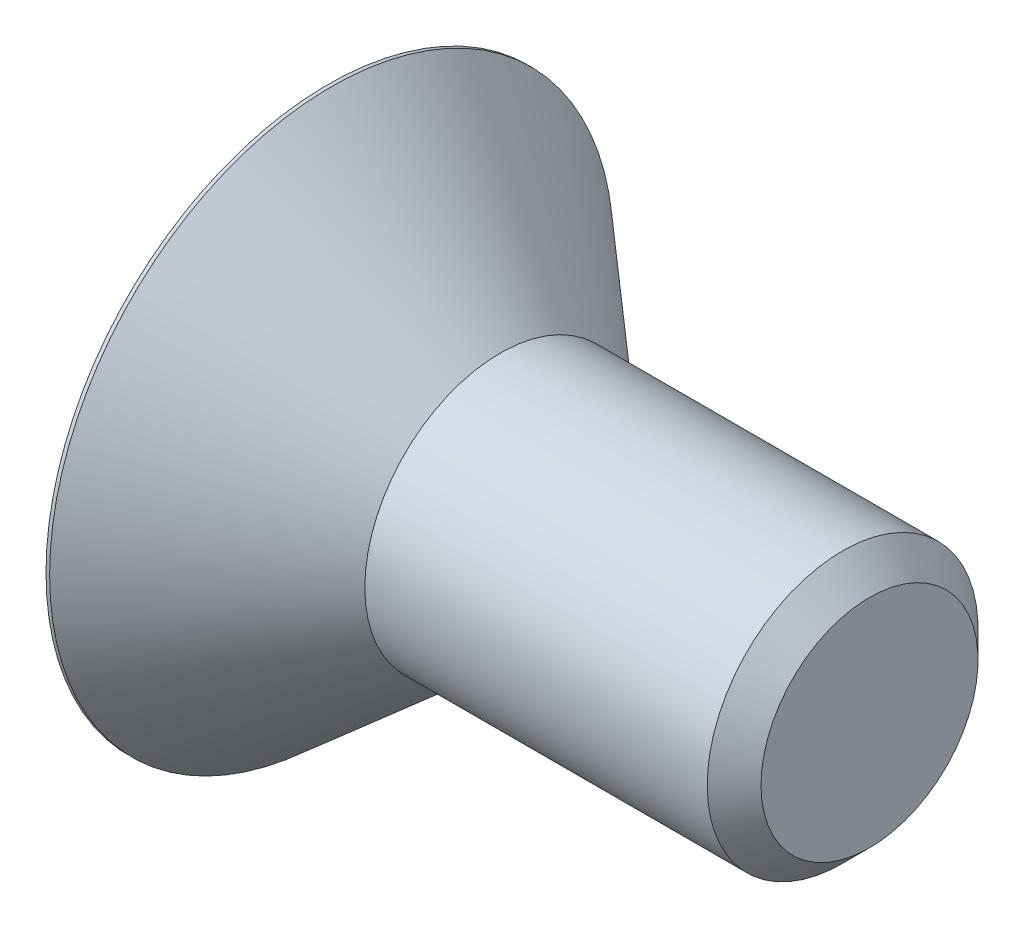
ISO-10303-21;
HEADER;
FILE_DESCRIPTION(('STEP AP214'),'2;1');
FILE_NAME('part.step','',(''),(''),'','','');
FILE_SCHEMA(('AUTOMOTIVE_DESIGN { 1 0 10303 214 1 1 1 1 }'));
ENDSEC;
DATA;
#1=APPLICATION_CONTEXT('core data for automotive mechanical design processes');
#2=APPLICATION_PROTOCOL_DEFINITION('international standard','automotive_design',2000,#1);
#3=PRODUCT_CONTEXT('',#1,'mechanical');
#4=PRODUCT('Part','Part','',(#3));
#5=PRODUCT_RELATED_PRODUCT_CATEGORY('part','',(#4));
#6=PRODUCT_DEFINITION_FORMATION('','',#4);
#7=PRODUCT_DEFINITION_CONTEXT('part definition',#1,'design');
#8=PRODUCT_DEFINITION('design','',#6,#7);
#9=PRODUCT_DEFINITION_SHAPE('','',#8);
#10=(LENGTH_UNIT() NAMED_UNIT(*) SI_UNIT(.MILLI.,.METRE.));
#11=(NAMED_UNIT(*) PLANE_ANGLE_UNIT() SI_UNIT($,.RADIAN.));
#12=(NAMED_UNIT(*) SI_UNIT($,.STERADIAN.) SOLID_ANGLE_UNIT());
#13=UNCERTAINTY_MEASURE_WITH_UNIT(LENGTH_MEASURE(1.E-05),#10,'distance_accuracy_value','');
#14=(GEOMETRIC_REPRESENTATION_CONTEXT(3) GLOBAL_UNCERTAINTY_ASSIGNED_CONTEXT((#13)) GLOBAL_UNIT_ASSIGNED_CONTEXT((#10,
#11,#12)) REPRESENTATION_CONTEXT('',''));
#15=CARTESIAN_POINT('',(0.,0.,0.));
#16=DIRECTION('',(0.,0.,1.));
#17=DIRECTION('',(1.,0.,0.));
#18=AXIS2_PLACEMENT_3D('',#15,#16,#17);
#19=CARTESIAN_POINT('',(0.,0.,0.));
#20=DIRECTION('',(-1.,0.,0.));
#21=DIRECTION('',(0.,0.,1.));
#22=AXIS2_PLACEMENT_3D('',#19,#20,#21);
#23=PLANE('',#22);
#24=CARTESIAN_POINT('',(0.,0.,0.));
#25=DIRECTION('',(-1.,0.,0.));
#26=DIRECTION('',(0.,0.,1.));
#27=AXIS2_PLACEMENT_3D('',#24,#25,#26);
#28=CIRCLE('',#27,9.9187);
#29=CARTESIAN_POINT('',(0.,0.,9.9187));
#30=VERTEX_POINT('',#29);
#31=EDGE_CURVE('E11',#30,#30,#28,.T.);
#32=ORIENTED_EDGE('',*,*,#31,.T.);
#33=EDGE_LOOP('',(#32));
#34=FACE_BOUND('',#33,.T.);
#35=DIRECTION('',(0.,-0.5,-0.866025403784439));
#36=VECTOR('',#35,1.);
#37=CARTESIAN_POINT('',(0.,-1.60431783401336,2.77876));
#38=LINE('',#37,#36);
#39=CARTESIAN_POINT('',(0.,-1.60431783401336,2.77876));
#40=VERTEX_POINT('',#39);
#41=CARTESIAN_POINT('',(0.,-3.20863566802673,0.));
#42=VERTEX_POINT('',#41);
#43=EDGE_CURVE('E122',#40,#42,#38,.T.);
#44=ORIENTED_EDGE('',*,*,#43,.T.);
#45=DIRECTION('',(0.,0.5,-0.866025403784439));
#46=VECTOR('',#45,1.);
#47=CARTESIAN_POINT('',(0.,-3.20863566802673,0.));
#48=LINE('',#47,#46);
#49=CARTESIAN_POINT('',(0.,-1.60431783401336,-2.77876));
#50=VERTEX_POINT('',#49);
#51=EDGE_CURVE('E44',#42,#50,#48,.T.);
#52=ORIENTED_EDGE('',*,*,#51,.T.);
#53=DIRECTION('',(0.,1.,0.));
#54=VECTOR('',#53,1.);
#55=CARTESIAN_POINT('',(0.,-1.60431783401336,-2.77876));
#56=LINE('',#55,#54);
#57=CARTESIAN_POINT('',(0.,1.60431783401337,-2.77876));
#58=VERTEX_POINT('',#57);
#59=EDGE_CURVE('E105',#50,#58,#56,.T.);
#60=ORIENTED_EDGE('',*,*,#59,.T.);
#61=DIRECTION('',(0.,0.5,0.866025403784439));
#62=VECTOR('',#61,1.);
#63=CARTESIAN_POINT('',(0.,1.60431783401337,-2.77876));
#64=LINE('',#63,#62);
#65=CARTESIAN_POINT('',(0.,3.20863566802673,0.));
#66=VERTEX_POINT('',#65);
#67=EDGE_CURVE('E112',#58,#66,#64,.T.);
#68=ORIENTED_EDGE('',*,*,#67,.T.);
#69=DIRECTION('',(0.,-0.5,0.866025403784439));
#70=VECTOR('',#69,1.);
#71=CARTESIAN_POINT('',(0.,3.20863566802673,0.));
#72=LINE('',#71,#70);
#73=CARTESIAN_POINT('',(0.,1.60431783401337,2.77876));
#74=VERTEX_POINT('',#73);
#75=EDGE_CURVE('E126',#66,#74,#72,.T.);
#76=ORIENTED_EDGE('',*,*,#75,.T.);
#77=DIRECTION('',(0.,-1.,0.));
#78=VECTOR('',#77,1.);
#79=CARTESIAN_POINT('',(0.,1.60431783401337,2.77876));
#80=LINE('',#79,#78);
#81=EDGE_CURVE('E129',#74,#40,#80,.T.);
#82=ORIENTED_EDGE('',*,*,#81,.T.);
#83=EDGE_LOOP('',(#44,#52,#60,#68,#76,#82));
#84=FACE_BOUND('',#83,.T.);
#85=ADVANCED_FACE('F30',(#34,#84),#23,.T.);
#86=CARTESIAN_POINT('',(0.,0.,0.));
#87=DIRECTION('',(-1.,0.,0.));
#88=DIRECTION('',(0.,0.,1.));
#89=AXIS2_PLACEMENT_3D('',#86,#87,#88);
#90=CYLINDRICAL_SURFACE('',#89,9.9187);
#91=CARTESIAN_POINT('',(0.127,0.,0.));
#92=DIRECTION('',(-1.,0.,0.));
#93=DIRECTION('',(0.,0.,1.));
#94=AXIS2_PLACEMENT_3D('',#91,#92,#93);
#95=CIRCLE('',#94,9.9187);
#96=CARTESIAN_POINT('',(0.127,0.,9.9187));
#97=VERTEX_POINT('',#96);
#98=EDGE_CURVE('E37',#97,#97,#95,.T.);
#99=ORIENTED_EDGE('',*,*,#98,.T.);
#100=EDGE_LOOP('',(#99));
#101=FACE_BOUND('',#100,.T.);
#102=ORIENTED_EDGE('',*,*,#31,.F.);
#103=EDGE_LOOP('',(#102));
#104=FACE_BOUND('',#103,.T.);
#105=ADVANCED_FACE('F179',(#101,#104),#90,.T.);
#106=CARTESIAN_POINT('',(0.127,0.,0.));
#107=DIRECTION('',(-1.,0.,0.));
#108=DIRECTION('',(0.,0.,1.));
#109=AXIS2_PLACEMENT_3D('',#106,#107,#108);
#110=CONICAL_SURFACE('',#109,9.9187,0.715584993317677);
#111=CARTESIAN_POINT('',(6.05852958131295,0.,0.));
#112=DIRECTION('',(-1.,0.,0.));
#113=DIRECTION('',(0.,0.,1.));
#114=AXIS2_PLACEMENT_3D('',#111,#112,#113);
#115=CIRCLE('',#114,4.7625);
#116=CARTESIAN_POINT('',(6.05852958131295,0.,4.7625));
#117=VERTEX_POINT('',#116);
#118=EDGE_CURVE('E174',#117,#117,#115,.T.);
#119=ORIENTED_EDGE('',*,*,#118,.T.);
#120=EDGE_LOOP('',(#119));
#121=FACE_BOUND('',#120,.T.);
#122=ORIENTED_EDGE('',*,*,#98,.F.);
#123=EDGE_LOOP('',(#122));
#124=FACE_BOUND('',#123,.T.);
#125=ADVANCED_FACE('F182',(#121,#124),#110,.T.);
#126=CARTESIAN_POINT('',(0.,0.,0.));
#127=DIRECTION('',(-1.,0.,0.));
#128=DIRECTION('',(0.,0.,1.));
#129=AXIS2_PLACEMENT_3D('',#126,#127,#128);
#130=CYLINDRICAL_SURFACE('',#129,4.7625);
#131=CARTESIAN_POINT('',(18.10385,0.,0.));
#132=DIRECTION('',(-1.,0.,0.));
#133=DIRECTION('',(0.,0.,1.));
#134=AXIS2_PLACEMENT_3D('',#131,#132,#133);
#135=CIRCLE('',#134,4.7625);
#136=CARTESIAN_POINT('',(18.10385,0.,4.7625));
#137=VERTEX_POINT('',#136);
#138=EDGE_CURVE('E171',#137,#137,#135,.T.);
#139=ORIENTED_EDGE('',*,*,#138,.T.);
#140=EDGE_LOOP('',(#139));
#141=FACE_BOUND('',#140,.T.);
#142=ORIENTED_EDGE('',*,*,#118,.F.);
#143=EDGE_LOOP('',(#142));
#144=FACE_BOUND('',#143,.T.);
#145=ADVANCED_FACE('F184',(#141,#144),#130,.T.);
#146=CARTESIAN_POINT('',(19.05,0.,0.));
#147=DIRECTION('',(-1.,0.,0.));
#148=DIRECTION('',(0.,0.,1.));
#149=AXIS2_PLACEMENT_3D('',#146,#147,#148);
#150=CONICAL_SURFACE('',#149,3.81635,0.785398163397456);
#151=ORIENTED_EDGE('',*,*,#138,.F.);
#152=EDGE_LOOP('',(#151));
#153=FACE_BOUND('',#152,.T.);
#154=CARTESIAN_POINT('',(19.05,0.,0.));
#155=DIRECTION('',(-1.,0.,0.));
#156=DIRECTION('',(0.,0.,1.));
#157=AXIS2_PLACEMENT_3D('',#154,#155,#156);
#158=CIRCLE('',#157,3.81635);
#159=CARTESIAN_POINT('',(19.05,0.,3.81635));
#160=VERTEX_POINT('',#159);
#161=EDGE_CURVE('E167',#160,#160,#158,.T.);
#162=ORIENTED_EDGE('',*,*,#161,.T.);
#163=EDGE_LOOP('',(#162));
#164=FACE_BOUND('',#163,.T.);
#165=ADVANCED_FACE('F191',(#153,#164),#150,.T.);
#166=CARTESIAN_POINT('',(19.05,3.81635,0.));
#167=DIRECTION('',(1.,0.,0.));
#168=DIRECTION('',(0.,0.,-1.));
#169=AXIS2_PLACEMENT_3D('',#166,#167,#168);
#170=PLANE('',#169);
#171=ORIENTED_EDGE('',*,*,#161,.F.);
#172=EDGE_LOOP('',(#171));
#173=FACE_BOUND('',#172,.T.);
#174=ADVANCED_FACE('F223',(#173),#170,.T.);
#175=CARTESIAN_POINT('',(4.0386,-3.20863566802673,0.));
#176=DIRECTION('',(0.,0.866025403784439,0.5));
#177=DIRECTION('',(0.,-0.5,0.866025403784439));
#178=AXIS2_PLACEMENT_3D('',#175,#176,#177);
#179=PLANE('',#178);
#180=ORIENTED_EDGE('',*,*,#51,.F.);
#181=DIRECTION('',(-1.,0.,0.));
#182=VECTOR('',#181,1.);
#183=CARTESIAN_POINT('',(4.0386,-3.20863566802673,0.));
#184=LINE('',#183,#182);
#185=CARTESIAN_POINT('',(4.0386,-3.20863566802673,0.));
#186=VERTEX_POINT('',#185);
#187=EDGE_CURVE('E152',#186,#42,#184,.T.);
#188=ORIENTED_EDGE('',*,*,#187,.F.);
#189=DIRECTION('',(0.,0.5,-0.866025403784439));
#190=VECTOR('',#189,1.);
#191=CARTESIAN_POINT('',(4.0386,-3.20863566802673,0.));
#192=LINE('',#191,#190);
#193=CARTESIAN_POINT('',(4.0386,-2.40647675102005,-1.38938));
#194=VERTEX_POINT('',#193);
#195=EDGE_CURVE('E132',#186,#194,#192,.T.);
#196=ORIENTED_EDGE('',*,*,#195,.T.);
#197=CARTESIAN_POINT('',(4.0386,-1.60431783401336,-2.77876));
#198=VERTEX_POINT('',#197);
#199=EDGE_CURVE('E117',#194,#198,#192,.T.);
#200=ORIENTED_EDGE('',*,*,#199,.T.);
#201=DIRECTION('',(-1.,0.,0.));
#202=VECTOR('',#201,1.);
#203=CARTESIAN_POINT('',(4.0386,-1.60431783401336,-2.77876));
#204=LINE('',#203,#202);
#205=EDGE_CURVE('E107',#198,#50,#204,.T.);
#206=ORIENTED_EDGE('',*,*,#205,.T.);
#207=EDGE_LOOP('',(#180,#188,#196,#200,#206));
#208=FACE_BOUND('',#207,.T.);
#209=ADVANCED_FACE('F114',(#208),#179,.T.);
#210=CARTESIAN_POINT('',(4.0386,-1.60431783401336,-2.77876));
#211=DIRECTION('',(0.,0.,1.));
#212=DIRECTION('',(1.,0.,0.));
#213=AXIS2_PLACEMENT_3D('',#210,#211,#212);
#214=PLANE('',#213);
#215=ORIENTED_EDGE('',*,*,#59,.F.);
#216=ORIENTED_EDGE('',*,*,#205,.F.);
#217=DIRECTION('',(0.,1.,0.));
#218=VECTOR('',#217,1.);
#219=CARTESIAN_POINT('',(4.0386,-1.60431783401336,-2.77876));
#220=LINE('',#219,#218);
#221=CARTESIAN_POINT('',(4.0386,0.,-2.77876));
#222=VERTEX_POINT('',#221);
#223=EDGE_CURVE('E52',#198,#222,#220,.T.);
#224=ORIENTED_EDGE('',*,*,#223,.T.);
#225=CARTESIAN_POINT('',(4.0386,1.60431783401337,-2.77876));
#226=VERTEX_POINT('',#225);
#227=EDGE_CURVE('E134',#222,#226,#220,.T.);
#228=ORIENTED_EDGE('',*,*,#227,.T.);
#229=DIRECTION('',(-1.,0.,0.));
#230=VECTOR('',#229,1.);
#231=CARTESIAN_POINT('',(4.0386,1.60431783401337,-2.77876));
#232=LINE('',#231,#230);
#233=EDGE_CURVE('E109',#226,#58,#232,.T.);
#234=ORIENTED_EDGE('',*,*,#233,.T.);
#235=EDGE_LOOP('',(#215,#216,#224,#228,#234));
#236=FACE_BOUND('',#235,.T.);
#237=ADVANCED_FACE('F106',(#236),#214,.T.);
#238=CARTESIAN_POINT('',(4.0386,1.60431783401337,-2.77876));
#239=DIRECTION('',(0.,-0.866025403784439,0.5));
#240=DIRECTION('',(0.,-0.5,-0.866025403784439));
#241=AXIS2_PLACEMENT_3D('',#238,#239,#240);
#242=PLANE('',#241);
#243=ORIENTED_EDGE('',*,*,#67,.F.);
#244=ORIENTED_EDGE('',*,*,#233,.F.);
#245=DIRECTION('',(0.,0.5,0.866025403784439));
#246=VECTOR('',#245,1.);
#247=CARTESIAN_POINT('',(4.0386,1.60431783401337,-2.77876));
#248=LINE('',#247,#246);
#249=CARTESIAN_POINT('',(4.0386,2.40647675102005,-1.38938));
#250=VERTEX_POINT('',#249);
#251=EDGE_CURVE('E137',#226,#250,#248,.T.);
#252=ORIENTED_EDGE('',*,*,#251,.T.);
#253=CARTESIAN_POINT('',(4.0386,3.20863566802673,0.));
#254=VERTEX_POINT('',#253);
#255=EDGE_CURVE('E136',#250,#254,#248,.T.);
#256=ORIENTED_EDGE('',*,*,#255,.T.);
#257=DIRECTION('',(-1.,0.,0.));
#258=VECTOR('',#257,1.);
#259=CARTESIAN_POINT('',(4.0386,3.20863566802673,0.));
#260=LINE('',#259,#258);
#261=EDGE_CURVE('E160',#254,#66,#260,.T.);
#262=ORIENTED_EDGE('',*,*,#261,.T.);
#263=EDGE_LOOP('',(#243,#244,#252,#256,#262));
#264=FACE_BOUND('',#263,.T.);
#265=ADVANCED_FACE('F247',(#264),#242,.T.);
#266=CARTESIAN_POINT('',(4.0386,3.20863566802673,0.));
#267=DIRECTION('',(0.,-0.866025403784439,-0.5));
#268=DIRECTION('',(0.,0.5,-0.866025403784439));
#269=AXIS2_PLACEMENT_3D('',#266,#267,#268);
#270=PLANE('',#269);
#271=ORIENTED_EDGE('',*,*,#75,.F.);
#272=ORIENTED_EDGE('',*,*,#261,.F.);
#273=DIRECTION('',(0.,-0.5,0.866025403784439));
#274=VECTOR('',#273,1.);
#275=CARTESIAN_POINT('',(4.0386,3.20863566802673,0.));
#276=LINE('',#275,#274);
#277=CARTESIAN_POINT('',(4.0386,2.40647675102005,1.38938));
#278=VERTEX_POINT('',#277);
#279=EDGE_CURVE('E141',#254,#278,#276,.T.);
#280=ORIENTED_EDGE('',*,*,#279,.T.);
#281=CARTESIAN_POINT('',(4.0386,1.60431783401337,2.77876));
#282=VERTEX_POINT('',#281);
#283=EDGE_CURVE('E140',#278,#282,#276,.T.);
#284=ORIENTED_EDGE('',*,*,#283,.T.);
#285=DIRECTION('',(-1.,0.,0.));
#286=VECTOR('',#285,1.);
#287=CARTESIAN_POINT('',(4.0386,1.60431783401337,2.77876));
#288=LINE('',#287,#286);
#289=EDGE_CURVE('E157',#282,#74,#288,.T.);
#290=ORIENTED_EDGE('',*,*,#289,.T.);
#291=EDGE_LOOP('',(#271,#272,#280,#284,#290));
#292=FACE_BOUND('',#291,.T.);
#293=ADVANCED_FACE('F254',(#292),#270,.T.);
#294=CARTESIAN_POINT('',(4.0386,1.60431783401337,2.77876));
#295=DIRECTION('',(0.,0.,-1.));
#296=DIRECTION('',(-1.,0.,0.));
#297=AXIS2_PLACEMENT_3D('',#294,#295,#296);
#298=PLANE('',#297);
#299=ORIENTED_EDGE('',*,*,#81,.F.);
#300=ORIENTED_EDGE('',*,*,#289,.F.);
#301=DIRECTION('',(0.,-1.,0.));
#302=VECTOR('',#301,1.);
#303=CARTESIAN_POINT('',(4.0386,1.60431783401337,2.77876));
#304=LINE('',#303,#302);
#305=CARTESIAN_POINT('',(4.0386,0.,2.77876));
#306=VERTEX_POINT('',#305);
#307=EDGE_CURVE('E145',#282,#306,#304,.T.);
#308=ORIENTED_EDGE('',*,*,#307,.T.);
#309=CARTESIAN_POINT('',(4.0386,-1.60431783401336,2.77876));
#310=VERTEX_POINT('',#309);
#311=EDGE_CURVE('E144',#306,#310,#304,.T.);
#312=ORIENTED_EDGE('',*,*,#311,.T.);
#313=DIRECTION('',(-1.,0.,0.));
#314=VECTOR('',#313,1.);
#315=CARTESIAN_POINT('',(4.0386,-1.60431783401336,2.77876));
#316=LINE('',#315,#314);
#317=EDGE_CURVE('E154',#310,#40,#316,.T.);
#318=ORIENTED_EDGE('',*,*,#317,.T.);
#319=EDGE_LOOP('',(#299,#300,#308,#312,#318));
#320=FACE_BOUND('',#319,.T.);
#321=ADVANCED_FACE('F262',(#320),#298,.T.);
#322=CARTESIAN_POINT('',(4.0386,-1.60431783401336,2.77876));
#323=DIRECTION('',(0.,0.866025403784439,-0.5));
#324=DIRECTION('',(0.,0.5,0.866025403784439));
#325=AXIS2_PLACEMENT_3D('',#322,#323,#324);
#326=PLANE('',#325);
#327=ORIENTED_EDGE('',*,*,#43,.F.);
#328=ORIENTED_EDGE('',*,*,#317,.F.);
#329=DIRECTION('',(0.,-0.5,-0.866025403784439));
#330=VECTOR('',#329,1.);
#331=CARTESIAN_POINT('',(4.0386,-1.60431783401336,2.77876));
#332=LINE('',#331,#330);
#333=CARTESIAN_POINT('',(4.0386,-2.40647675102005,1.38938));
#334=VERTEX_POINT('',#333);
#335=EDGE_CURVE('E149',#310,#334,#332,.T.);
#336=ORIENTED_EDGE('',*,*,#335,.T.);
#337=EDGE_CURVE('E148',#334,#186,#332,.T.);
#338=ORIENTED_EDGE('',*,*,#337,.T.);
#339=ORIENTED_EDGE('',*,*,#187,.T.);
#340=EDGE_LOOP('',(#327,#328,#336,#338,#339));
#341=FACE_BOUND('',#340,.T.);
#342=ADVANCED_FACE('F270',(#341),#326,.T.);
#343=CARTESIAN_POINT('',(4.0386,0.,-5.55752));
#344=DIRECTION('',(1.,0.,0.));
#345=DIRECTION('',(0.,0.,-1.));
#346=AXIS2_PLACEMENT_3D('',#343,#344,#345);
#347=PLANE('',#346);
#348=ORIENTED_EDGE('',*,*,#223,.F.);
#349=ORIENTED_EDGE('',*,*,#199,.F.);
#350=CARTESIAN_POINT('',(4.0386,0.,0.));
#351=DIRECTION('',(-1.,0.,0.));
#352=DIRECTION('',(0.,0.,1.));
#353=AXIS2_PLACEMENT_3D('',#350,#351,#352);
#354=CIRCLE('',#353,2.77876);
#355=EDGE_CURVE('E376',#222,#194,#354,.T.);
#356=ORIENTED_EDGE('',*,*,#355,.F.);
#357=EDGE_LOOP('',(#348,#349,#356));
#358=FACE_BOUND('',#357,.T.);
#359=ADVANCED_FACE('F278',(#358),#347,.F.);
#360=ORIENTED_EDGE('',*,*,#195,.F.);
#361=ORIENTED_EDGE('',*,*,#337,.F.);
#362=EDGE_CURVE('E378',#194,#334,#354,.T.);
#363=ORIENTED_EDGE('',*,*,#362,.F.);
#364=EDGE_LOOP('',(#360,#361,#363));
#365=FACE_BOUND('',#364,.T.);
#366=ADVANCED_FACE('F286',(#365),#347,.F.);
#367=ORIENTED_EDGE('',*,*,#335,.F.);
#368=ORIENTED_EDGE('',*,*,#311,.F.);
#369=EDGE_CURVE('E118',#334,#306,#354,.T.);
#370=ORIENTED_EDGE('',*,*,#369,.F.);
#371=EDGE_LOOP('',(#367,#368,#370));
#372=FACE_BOUND('',#371,.T.);
#373=ADVANCED_FACE('F295',(#372),#347,.F.);
#374=ORIENTED_EDGE('',*,*,#307,.F.);
#375=ORIENTED_EDGE('',*,*,#283,.F.);
#376=EDGE_CURVE('E164',#306,#278,#354,.T.);
#377=ORIENTED_EDGE('',*,*,#376,.F.);
#378=EDGE_LOOP('',(#374,#375,#377));
#379=FACE_BOUND('',#378,.T.);
#380=ADVANCED_FACE('F302',(#379),#347,.F.);
#381=ORIENTED_EDGE('',*,*,#279,.F.);
#382=ORIENTED_EDGE('',*,*,#255,.F.);
#383=EDGE_CURVE('E168',#278,#250,#354,.T.);
#384=ORIENTED_EDGE('',*,*,#383,.F.);
#385=EDGE_LOOP('',(#381,#382,#384));
#386=FACE_BOUND('',#385,.T.);
#387=ADVANCED_FACE('F309',(#386),#347,.F.);
#388=ORIENTED_EDGE('',*,*,#251,.F.);
#389=ORIENTED_EDGE('',*,*,#227,.F.);
#390=EDGE_CURVE('E375',#250,#222,#354,.T.);
#391=ORIENTED_EDGE('',*,*,#390,.F.);
#392=EDGE_LOOP('',(#388,#389,#391));
#393=FACE_BOUND('',#392,.T.);
#394=ADVANCED_FACE('F289',(#393),#347,.F.);
#395=CARTESIAN_POINT('',(4.0386,0.,0.));
#396=DIRECTION('',(-1.,0.,0.));
#397=DIRECTION('',(0.,0.,1.));
#398=AXIS2_PLACEMENT_3D('',#395,#396,#397);
#399=CONICAL_SURFACE('',#398,2.77876,1.04719755119659);
#400=CARTESIAN_POINT('',(5.64291783401339,0.,0.));
#401=VERTEX_POINT('',#400);
#402=VERTEX_LOOP('',#401);
#403=FACE_BOUND('',#402,.T.);
#404=ORIENTED_EDGE('',*,*,#376,.T.);
#405=ORIENTED_EDGE('',*,*,#383,.T.);
#406=ORIENTED_EDGE('',*,*,#390,.T.);
#407=ORIENTED_EDGE('',*,*,#355,.T.);
#408=ORIENTED_EDGE('',*,*,#362,.T.);
#409=ORIENTED_EDGE('',*,*,#369,.T.);
#410=EDGE_LOOP('',(#404,#405,#406,#407,#408,#409));
#411=FACE_BOUND('',#410,.T.);
#412=ADVANCED_FACE('F322',(#403,#411),#399,.F.);
#413=CLOSED_SHELL('',(#85,#105,#125,#145,#165,#174,#209,#237,#265,#293,#321,#342,#359,#366,#373,
#380,#387,#394,#412));
#414=MANIFOLD_SOLID_BREP('B2',#413);
#415=ADVANCED_BREP_SHAPE_REPRESENTATION('',(#18,#414),#14);
#416=SHAPE_DEFINITION_REPRESENTATION(#9,#415);
ENDSEC;
END-ISO-10303-21;
